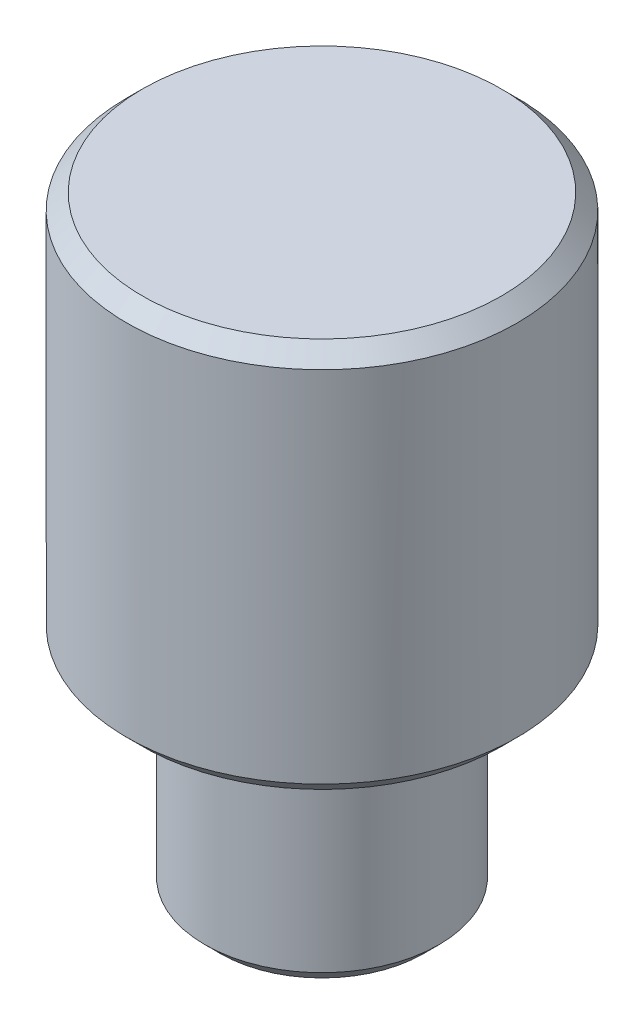
ISO-10303-21;
HEADER;
FILE_DESCRIPTION(('STEP AP214'),'2;1');
FILE_NAME('part.step','',(''),(''),'','','');
FILE_SCHEMA(('AUTOMOTIVE_DESIGN { 1 0 10303 214 1 1 1 1 }'));
ENDSEC;
DATA;
#1=APPLICATION_CONTEXT('core data for automotive mechanical design processes');
#2=APPLICATION_PROTOCOL_DEFINITION('international standard','automotive_design',2000,#1);
#3=PRODUCT_CONTEXT('',#1,'mechanical');
#4=PRODUCT('Part','Part','',(#3));
#5=PRODUCT_RELATED_PRODUCT_CATEGORY('part','',(#4));
#6=PRODUCT_DEFINITION_FORMATION('','',#4);
#7=PRODUCT_DEFINITION_CONTEXT('part definition',#1,'design');
#8=PRODUCT_DEFINITION('design','',#6,#7);
#9=PRODUCT_DEFINITION_SHAPE('','',#8);
#10=(LENGTH_UNIT() NAMED_UNIT(*) SI_UNIT(.MILLI.,.METRE.));
#11=(NAMED_UNIT(*) PLANE_ANGLE_UNIT() SI_UNIT($,.RADIAN.));
#12=(NAMED_UNIT(*) SI_UNIT($,.STERADIAN.) SOLID_ANGLE_UNIT());
#13=UNCERTAINTY_MEASURE_WITH_UNIT(LENGTH_MEASURE(1.E-05),#10,'distance_accuracy_value','');
#14=(GEOMETRIC_REPRESENTATION_CONTEXT(3) GLOBAL_UNCERTAINTY_ASSIGNED_CONTEXT((#13)) GLOBAL_UNIT_ASSIGNED_CONTEXT((#10,
#11,#12)) REPRESENTATION_CONTEXT('',''));
#15=CARTESIAN_POINT('',(0.,0.,0.));
#16=DIRECTION('',(0.,0.,1.));
#17=DIRECTION('',(1.,0.,0.));
#18=AXIS2_PLACEMENT_3D('',#15,#16,#17);
#19=CARTESIAN_POINT('',(0.,0.,0.));
#20=DIRECTION('',(0.,-1.,0.));
#21=DIRECTION('',(1.,0.,0.));
#22=AXIS2_PLACEMENT_3D('',#19,#20,#21);
#23=PLANE('',#22);
#24=CARTESIAN_POINT('',(0.,0.,0.));
#25=DIRECTION('',(0.,-1.,0.));
#26=DIRECTION('',(1.,0.,0.));
#27=AXIS2_PLACEMENT_3D('',#24,#25,#26);
#28=CIRCLE('',#27,23.);
#29=CARTESIAN_POINT('',(23.,0.,0.));
#30=VERTEX_POINT('',#29);
#31=EDGE_CURVE('E10',#30,#30,#28,.F.);
#32=ORIENTED_EDGE('',*,*,#31,.T.);
#33=EDGE_LOOP('',(#32));
#34=FACE_BOUND('',#33,.T.);
#35=ADVANCED_FACE('F48',(#34),#23,.F.);
#36=CARTESIAN_POINT('',(0.,5.,0.));
#37=DIRECTION('',(0.,1.,0.));
#38=DIRECTION('',(-1.,0.,0.));
#39=AXIS2_PLACEMENT_3D('',#36,#37,#38);
#40=CYLINDRICAL_SURFACE('',#39,25.);
#41=CARTESIAN_POINT('',(0.,-48.,0.));
#42=DIRECTION('',(0.,1.,0.));
#43=DIRECTION('',(-1.,0.,0.));
#44=AXIS2_PLACEMENT_3D('',#41,#42,#43);
#45=CIRCLE('',#44,25.);
#46=CARTESIAN_POINT('',(-25.,-48.,0.));
#47=VERTEX_POINT('',#46);
#48=EDGE_CURVE('E60',#47,#47,#45,.T.);
#49=ORIENTED_EDGE('',*,*,#48,.T.);
#50=EDGE_LOOP('',(#49));
#51=FACE_BOUND('',#50,.T.);
#52=CARTESIAN_POINT('',(0.,-1.99999999999999,0.));
#53=DIRECTION('',(0.,-1.,0.));
#54=DIRECTION('',(1.,0.,0.));
#55=AXIS2_PLACEMENT_3D('',#52,#53,#54);
#56=CIRCLE('',#55,25.);
#57=CARTESIAN_POINT('',(25.,-1.99999999999999,0.));
#58=VERTEX_POINT('',#57);
#59=EDGE_CURVE('E64',#58,#58,#56,.T.);
#60=ORIENTED_EDGE('',*,*,#59,.T.);
#61=EDGE_LOOP('',(#60));
#62=FACE_BOUND('',#61,.T.);
#63=ADVANCED_FACE('F93',(#51,#62),#40,.T.);
#64=CARTESIAN_POINT('',(25.,-50.,0.));
#65=DIRECTION('',(0.,1.,0.));
#66=DIRECTION('',(-1.,0.,0.));
#67=AXIS2_PLACEMENT_3D('',#64,#65,#66);
#68=PLANE('',#67);
#69=CARTESIAN_POINT('',(0.,-50.,0.));
#70=DIRECTION('',(0.,1.,0.));
#71=DIRECTION('',(-1.,0.,0.));
#72=AXIS2_PLACEMENT_3D('',#69,#70,#71);
#73=CIRCLE('',#72,23.);
#74=CARTESIAN_POINT('',(-23.,-50.,0.));
#75=VERTEX_POINT('',#74);
#76=EDGE_CURVE('E56',#75,#75,#73,.F.);
#77=ORIENTED_EDGE('',*,*,#76,.T.);
#78=EDGE_LOOP('',(#77));
#79=FACE_BOUND('',#78,.T.);
#80=CARTESIAN_POINT('',(0.,-50.,0.));
#81=DIRECTION('',(0.,1.,0.));
#82=DIRECTION('',(-1.,0.,0.));
#83=AXIS2_PLACEMENT_3D('',#80,#81,#82);
#84=CIRCLE('',#83,15.);
#85=CARTESIAN_POINT('',(-15.,-50.,0.));
#86=VERTEX_POINT('',#85);
#87=EDGE_CURVE('E75',#86,#86,#84,.T.);
#88=ORIENTED_EDGE('',*,*,#87,.T.);
#89=EDGE_LOOP('',(#88));
#90=FACE_BOUND('',#89,.T.);
#91=ADVANCED_FACE('F79',(#79,#90),#68,.F.);
#92=CARTESIAN_POINT('',(0.,5.,0.));
#93=DIRECTION('',(0.,1.,0.));
#94=DIRECTION('',(-1.,0.,0.));
#95=AXIS2_PLACEMENT_3D('',#92,#93,#94);
#96=CYLINDRICAL_SURFACE('',#95,15.);
#97=CARTESIAN_POINT('',(0.,-76.,0.));
#98=DIRECTION('',(0.,1.,0.));
#99=DIRECTION('',(-1.,0.,0.));
#100=AXIS2_PLACEMENT_3D('',#97,#98,#99);
#101=CIRCLE('',#100,15.);
#102=CARTESIAN_POINT('',(-15.,-76.,0.));
#103=VERTEX_POINT('',#102);
#104=EDGE_CURVE('E72',#103,#103,#101,.T.);
#105=ORIENTED_EDGE('',*,*,#104,.T.);
#106=EDGE_LOOP('',(#105));
#107=FACE_BOUND('',#106,.T.);
#108=ORIENTED_EDGE('',*,*,#87,.F.);
#109=EDGE_LOOP('',(#108));
#110=FACE_BOUND('',#109,.T.);
#111=ADVANCED_FACE('F81',(#107,#110),#96,.T.);
#112=CARTESIAN_POINT('',(15.,-78.,0.));
#113=DIRECTION('',(0.,1.,0.));
#114=DIRECTION('',(-1.,0.,0.));
#115=AXIS2_PLACEMENT_3D('',#112,#113,#114);
#116=PLANE('',#115);
#117=CARTESIAN_POINT('',(0.,-78.,0.));
#118=DIRECTION('',(0.,1.,0.));
#119=DIRECTION('',(-1.,0.,0.));
#120=AXIS2_PLACEMENT_3D('',#117,#118,#119);
#121=CIRCLE('',#120,13.);
#122=CARTESIAN_POINT('',(-13.,-78.,0.));
#123=VERTEX_POINT('',#122);
#124=EDGE_CURVE('E69',#123,#123,#121,.F.);
#125=ORIENTED_EDGE('',*,*,#124,.T.);
#126=EDGE_LOOP('',(#125));
#127=FACE_BOUND('',#126,.T.);
#128=ADVANCED_FACE('F83',(#127),#116,.F.);
#129=CARTESIAN_POINT('',(0.,-76.,0.));
#130=DIRECTION('',(0.,1.,0.));
#131=DIRECTION('',(-1.,0.,0.));
#132=AXIS2_PLACEMENT_3D('',#129,#130,#131);
#133=CONICAL_SURFACE('',#132,15.,0.785398163397454);
#134=ORIENTED_EDGE('',*,*,#124,.F.);
#135=EDGE_LOOP('',(#134));
#136=FACE_BOUND('',#135,.T.);
#137=ORIENTED_EDGE('',*,*,#104,.F.);
#138=EDGE_LOOP('',(#137));
#139=FACE_BOUND('',#138,.T.);
#140=ADVANCED_FACE('F89',(#136,#139),#133,.T.);
#141=CARTESIAN_POINT('',(0.,-48.,0.));
#142=DIRECTION('',(0.,1.,0.));
#143=DIRECTION('',(-1.,0.,0.));
#144=AXIS2_PLACEMENT_3D('',#141,#142,#143);
#145=CONICAL_SURFACE('',#144,25.,0.785398163397449);
#146=ORIENTED_EDGE('',*,*,#76,.F.);
#147=EDGE_LOOP('',(#146));
#148=FACE_BOUND('',#147,.T.);
#149=ORIENTED_EDGE('',*,*,#48,.F.);
#150=EDGE_LOOP('',(#149));
#151=FACE_BOUND('',#150,.T.);
#152=ADVANCED_FACE('F108',(#148,#151),#145,.T.);
#153=CARTESIAN_POINT('',(0.,0.,0.));
#154=DIRECTION('',(0.,-1.,0.));
#155=DIRECTION('',(1.,0.,0.));
#156=AXIS2_PLACEMENT_3D('',#153,#154,#155);
#157=CONICAL_SURFACE('',#156,23.,0.785398163397444);
#158=ORIENTED_EDGE('',*,*,#59,.F.);
#159=EDGE_LOOP('',(#158));
#160=FACE_BOUND('',#159,.T.);
#161=ORIENTED_EDGE('',*,*,#31,.F.);
#162=EDGE_LOOP('',(#161));
#163=FACE_BOUND('',#162,.T.);
#164=ADVANCED_FACE('F51',(#160,#163),#157,.T.);
#165=CLOSED_SHELL('',(#35,#63,#91,#111,#128,#140,#152,#164));
#166=MANIFOLD_SOLID_BREP('B2',#165);
#167=ADVANCED_BREP_SHAPE_REPRESENTATION('',(#18,#166),#14);
#168=SHAPE_DEFINITION_REPRESENTATION(#9,#167);
ENDSEC;
END-ISO-10303-21;
